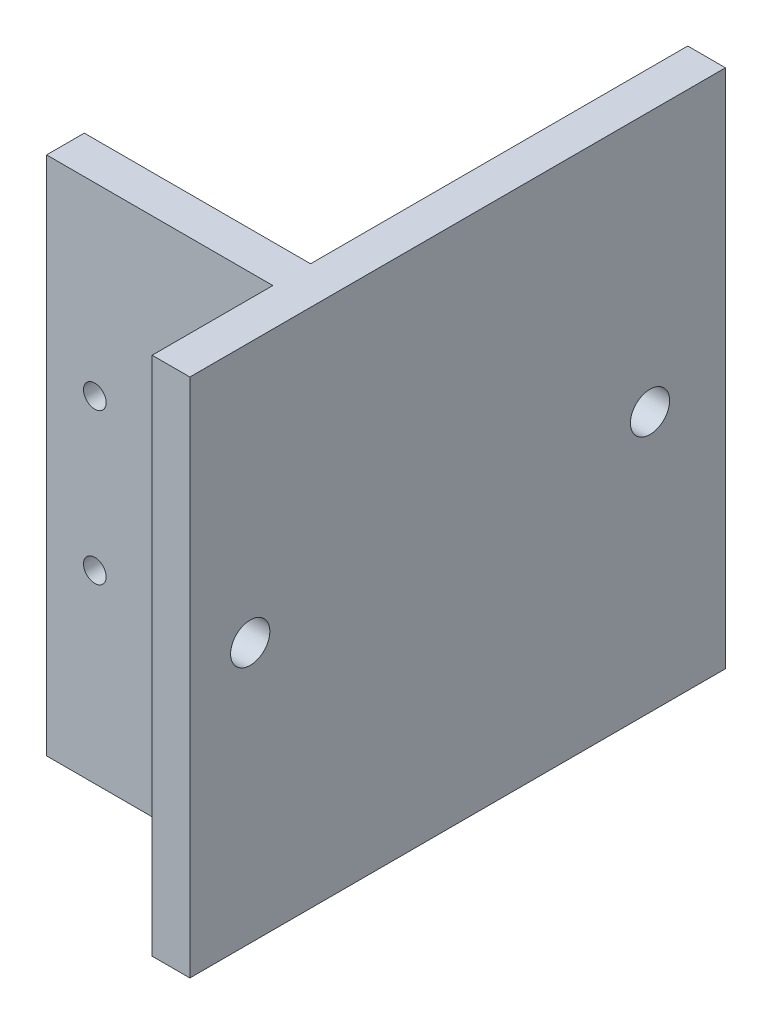
ISO-10303-21;
HEADER;
FILE_DESCRIPTION(('STEP AP214'),'2;1');
FILE_NAME('part.step','',(''),(''),'','','');
FILE_SCHEMA(('AUTOMOTIVE_DESIGN { 1 0 10303 214 1 1 1 1 }'));
ENDSEC;
DATA;
#1=APPLICATION_CONTEXT('core data for automotive mechanical design processes');
#2=APPLICATION_PROTOCOL_DEFINITION('international standard','automotive_design',2000,#1);
#3=PRODUCT_CONTEXT('',#1,'mechanical');
#4=PRODUCT('Part','Part','',(#3));
#5=PRODUCT_RELATED_PRODUCT_CATEGORY('part','',(#4));
#6=PRODUCT_DEFINITION_FORMATION('','',#4);
#7=PRODUCT_DEFINITION_CONTEXT('part definition',#1,'design');
#8=PRODUCT_DEFINITION('design','',#6,#7);
#9=PRODUCT_DEFINITION_SHAPE('','',#8);
#10=(LENGTH_UNIT() NAMED_UNIT(*) SI_UNIT(.MILLI.,.METRE.));
#11=(NAMED_UNIT(*) PLANE_ANGLE_UNIT() SI_UNIT($,.RADIAN.));
#12=(NAMED_UNIT(*) SI_UNIT($,.STERADIAN.) SOLID_ANGLE_UNIT());
#13=UNCERTAINTY_MEASURE_WITH_UNIT(LENGTH_MEASURE(1.E-05),#10,'distance_accuracy_value','');
#14=(GEOMETRIC_REPRESENTATION_CONTEXT(3) GLOBAL_UNCERTAINTY_ASSIGNED_CONTEXT((#13)) GLOBAL_UNIT_ASSIGNED_CONTEXT((#10,
#11,#12)) REPRESENTATION_CONTEXT('',''));
#15=CARTESIAN_POINT('',(0.,0.,0.));
#16=DIRECTION('',(0.,0.,1.));
#17=DIRECTION('',(1.,0.,0.));
#18=AXIS2_PLACEMENT_3D('',#15,#16,#17);
#19=CARTESIAN_POINT('',(0.,69.,0.));
#20=DIRECTION('',(1.,0.,0.));
#21=DIRECTION('',(0.,0.,-1.));
#22=AXIS2_PLACEMENT_3D('',#19,#20,#21);
#23=PLANE('',#22);
#24=DIRECTION('',(0.,0.,1.));
#25=VECTOR('',#24,1.);
#26=CARTESIAN_POINT('',(0.,0.,0.));
#27=LINE('',#26,#25);
#28=CARTESIAN_POINT('',(0.,0.,0.));
#29=VERTEX_POINT('',#28);
#30=CARTESIAN_POINT('',(0.,0.,5.));
#31=VERTEX_POINT('',#30);
#32=EDGE_CURVE('E151',#29,#31,#27,.T.);
#33=ORIENTED_EDGE('',*,*,#32,.T.);
#34=DIRECTION('',(0.,-1.,0.));
#35=VECTOR('',#34,1.);
#36=CARTESIAN_POINT('',(0.,69.,5.));
#37=LINE('',#36,#35);
#38=CARTESIAN_POINT('',(0.,69.,5.));
#39=VERTEX_POINT('',#38);
#40=EDGE_CURVE('E182',#39,#31,#37,.T.);
#41=ORIENTED_EDGE('',*,*,#40,.F.);
#42=DIRECTION('',(0.,0.,1.));
#43=VECTOR('',#42,1.);
#44=CARTESIAN_POINT('',(0.,69.,0.));
#45=LINE('',#44,#43);
#46=CARTESIAN_POINT('',(0.,69.,0.));
#47=VERTEX_POINT('',#46);
#48=EDGE_CURVE('E169',#47,#39,#45,.T.);
#49=ORIENTED_EDGE('',*,*,#48,.F.);
#50=DIRECTION('',(0.,-1.,0.));
#51=VECTOR('',#50,1.);
#52=CARTESIAN_POINT('',(0.,69.,0.));
#53=LINE('',#52,#51);
#54=EDGE_CURVE('E147',#47,#29,#53,.T.);
#55=ORIENTED_EDGE('',*,*,#54,.T.);
#56=EDGE_LOOP('',(#33,#41,#49,#55));
#57=FACE_BOUND('',#56,.T.);
#58=ADVANCED_FACE('F39',(#57),#23,.F.);
#59=CARTESIAN_POINT('',(0.,69.,5.));
#60=DIRECTION('',(0.,0.,-1.));
#61=DIRECTION('',(-1.,0.,0.));
#62=AXIS2_PLACEMENT_3D('',#59,#60,#61);
#63=PLANE('',#62);
#64=CARTESIAN_POINT('',(26.4,44.5,5.));
#65=DIRECTION('',(0.,0.,1.));
#66=DIRECTION('',(1.,0.,0.));
#67=AXIS2_PLACEMENT_3D('',#64,#65,#66);
#68=CIRCLE('',#67,1.50000000000002);
#69=CARTESIAN_POINT('',(27.9,44.5,5.));
#70=VERTEX_POINT('',#69);
#71=EDGE_CURVE('E198',#70,#70,#68,.T.);
#72=ORIENTED_EDGE('',*,*,#71,.F.);
#73=EDGE_LOOP('',(#72));
#74=FACE_BOUND('',#73,.T.);
#75=CARTESIAN_POINT('',(26.4,24.5,5.));
#76=DIRECTION('',(0.,0.,1.));
#77=DIRECTION('',(1.,0.,0.));
#78=AXIS2_PLACEMENT_3D('',#75,#76,#77);
#79=CIRCLE('',#78,1.50000000000002);
#80=CARTESIAN_POINT('',(27.9,24.5,5.));
#81=VERTEX_POINT('',#80);
#82=EDGE_CURVE('E194',#81,#81,#79,.T.);
#83=ORIENTED_EDGE('',*,*,#82,.F.);
#84=EDGE_LOOP('',(#83));
#85=FACE_BOUND('',#84,.T.);
#86=CARTESIAN_POINT('',(6.39999999999999,44.5,5.));
#87=DIRECTION('',(0.,0.,1.));
#88=DIRECTION('',(1.,0.,0.));
#89=AXIS2_PLACEMENT_3D('',#86,#87,#88);
#90=CIRCLE('',#89,1.50000000000001);
#91=CARTESIAN_POINT('',(7.90000000000001,44.5,5.));
#92=VERTEX_POINT('',#91);
#93=EDGE_CURVE('E190',#92,#92,#90,.T.);
#94=ORIENTED_EDGE('',*,*,#93,.F.);
#95=EDGE_LOOP('',(#94));
#96=FACE_BOUND('',#95,.T.);
#97=CARTESIAN_POINT('',(6.39999999999999,24.5,5.));
#98=DIRECTION('',(0.,0.,1.));
#99=DIRECTION('',(1.,0.,0.));
#100=AXIS2_PLACEMENT_3D('',#97,#98,#99);
#101=CIRCLE('',#100,1.50000000000001);
#102=CARTESIAN_POINT('',(7.90000000000001,24.5,5.));
#103=VERTEX_POINT('',#102);
#104=EDGE_CURVE('E186',#103,#103,#101,.T.);
#105=ORIENTED_EDGE('',*,*,#104,.F.);
#106=EDGE_LOOP('',(#105));
#107=FACE_BOUND('',#106,.T.);
#108=DIRECTION('',(1.,0.,0.));
#109=VECTOR('',#108,1.);
#110=CARTESIAN_POINT('',(0.,0.,5.));
#111=LINE('',#110,#109);
#112=CARTESIAN_POINT('',(30.,0.,5.));
#113=VERTEX_POINT('',#112);
#114=EDGE_CURVE('E154',#31,#113,#111,.T.);
#115=ORIENTED_EDGE('',*,*,#114,.T.);
#116=DIRECTION('',(0.,-1.,0.));
#117=VECTOR('',#116,1.);
#118=CARTESIAN_POINT('',(30.,69.,5.));
#119=LINE('',#118,#117);
#120=CARTESIAN_POINT('',(30.,69.,5.));
#121=VERTEX_POINT('',#120);
#122=EDGE_CURVE('E179',#121,#113,#119,.T.);
#123=ORIENTED_EDGE('',*,*,#122,.F.);
#124=DIRECTION('',(1.,0.,0.));
#125=VECTOR('',#124,1.);
#126=CARTESIAN_POINT('',(0.,69.,5.));
#127=LINE('',#126,#125);
#128=EDGE_CURVE('E104',#39,#121,#127,.T.);
#129=ORIENTED_EDGE('',*,*,#128,.F.);
#130=ORIENTED_EDGE('',*,*,#40,.T.);
#131=EDGE_LOOP('',(#115,#123,#129,#130));
#132=FACE_BOUND('',#131,.T.);
#133=ADVANCED_FACE('F242',(#74,#85,#96,#107,#132),#63,.F.);
#134=CARTESIAN_POINT('',(30.,69.,21.));
#135=DIRECTION('',(1.,0.,0.));
#136=DIRECTION('',(0.,0.,-1.));
#137=AXIS2_PLACEMENT_3D('',#134,#135,#136);
#138=PLANE('',#137);
#139=CARTESIAN_POINT('',(30.,34.5,13.));
#140=DIRECTION('',(-1.,0.,0.));
#141=DIRECTION('',(0.,0.,1.));
#142=AXIS2_PLACEMENT_3D('',#139,#140,#141);
#143=CIRCLE('',#142,2.6);
#144=CARTESIAN_POINT('',(30.,34.5,15.6));
#145=VERTEX_POINT('',#144);
#146=EDGE_CURVE('E201',#145,#145,#143,.T.);
#147=ORIENTED_EDGE('',*,*,#146,.F.);
#148=EDGE_LOOP('',(#147));
#149=FACE_BOUND('',#148,.T.);
#150=DIRECTION('',(0.,0.,1.));
#151=VECTOR('',#150,1.);
#152=CARTESIAN_POINT('',(30.,0.,21.));
#153=LINE('',#152,#151);
#154=CARTESIAN_POINT('',(30.,0.,21.));
#155=VERTEX_POINT('',#154);
#156=EDGE_CURVE('E157',#113,#155,#153,.T.);
#157=ORIENTED_EDGE('',*,*,#156,.T.);
#158=DIRECTION('',(0.,-1.,0.));
#159=VECTOR('',#158,1.);
#160=CARTESIAN_POINT('',(30.,69.,21.));
#161=LINE('',#160,#159);
#162=CARTESIAN_POINT('',(30.,69.,21.));
#163=VERTEX_POINT('',#162);
#164=EDGE_CURVE('E176',#163,#155,#161,.T.);
#165=ORIENTED_EDGE('',*,*,#164,.F.);
#166=DIRECTION('',(0.,0.,1.));
#167=VECTOR('',#166,1.);
#168=CARTESIAN_POINT('',(30.,69.,21.));
#169=LINE('',#168,#167);
#170=EDGE_CURVE('E223',#121,#163,#169,.T.);
#171=ORIENTED_EDGE('',*,*,#170,.F.);
#172=ORIENTED_EDGE('',*,*,#122,.T.);
#173=EDGE_LOOP('',(#157,#165,#171,#172));
#174=FACE_BOUND('',#173,.T.);
#175=ADVANCED_FACE('F241',(#149,#174),#138,.F.);
#176=CARTESIAN_POINT('',(30.,69.,21.));
#177=DIRECTION('',(0.,0.,-1.));
#178=DIRECTION('',(-1.,0.,0.));
#179=AXIS2_PLACEMENT_3D('',#176,#177,#178);
#180=PLANE('',#179);
#181=DIRECTION('',(1.,0.,0.));
#182=VECTOR('',#181,1.);
#183=CARTESIAN_POINT('',(30.,0.,21.));
#184=LINE('',#183,#182);
#185=CARTESIAN_POINT('',(35.,0.,21.));
#186=VERTEX_POINT('',#185);
#187=EDGE_CURVE('E159',#155,#186,#184,.T.);
#188=ORIENTED_EDGE('',*,*,#187,.T.);
#189=DIRECTION('',(0.,-1.,0.));
#190=VECTOR('',#189,1.);
#191=CARTESIAN_POINT('',(35.,69.,21.));
#192=LINE('',#191,#190);
#193=CARTESIAN_POINT('',(35.,69.,21.));
#194=VERTEX_POINT('',#193);
#195=EDGE_CURVE('E173',#194,#186,#192,.T.);
#196=ORIENTED_EDGE('',*,*,#195,.F.);
#197=DIRECTION('',(1.,0.,0.));
#198=VECTOR('',#197,1.);
#199=CARTESIAN_POINT('',(30.,69.,21.));
#200=LINE('',#199,#198);
#201=EDGE_CURVE('E229',#163,#194,#200,.T.);
#202=ORIENTED_EDGE('',*,*,#201,.F.);
#203=ORIENTED_EDGE('',*,*,#164,.T.);
#204=EDGE_LOOP('',(#188,#196,#202,#203));
#205=FACE_BOUND('',#204,.T.);
#206=ADVANCED_FACE('F235',(#205),#180,.F.);
#207=CARTESIAN_POINT('',(35.,69.,21.));
#208=DIRECTION('',(-1.,0.,0.));
#209=DIRECTION('',(0.,0.,1.));
#210=AXIS2_PLACEMENT_3D('',#207,#208,#209);
#211=PLANE('',#210);
#212=CARTESIAN_POINT('',(35.,34.5,-40.));
#213=DIRECTION('',(-1.,0.,0.));
#214=DIRECTION('',(0.,0.,1.));
#215=AXIS2_PLACEMENT_3D('',#212,#213,#214);
#216=CIRCLE('',#215,2.6);
#217=CARTESIAN_POINT('',(35.,34.5,-37.4));
#218=VERTEX_POINT('',#217);
#219=EDGE_CURVE('E340',#218,#218,#216,.T.);
#220=ORIENTED_EDGE('',*,*,#219,.T.);
#221=EDGE_LOOP('',(#220));
#222=FACE_BOUND('',#221,.T.);
#223=CARTESIAN_POINT('',(35.,34.5,13.));
#224=DIRECTION('',(-1.,0.,0.));
#225=DIRECTION('',(0.,0.,1.));
#226=AXIS2_PLACEMENT_3D('',#223,#224,#225);
#227=CIRCLE('',#226,2.6);
#228=CARTESIAN_POINT('',(35.,34.5,15.6));
#229=VERTEX_POINT('',#228);
#230=EDGE_CURVE('E199',#229,#229,#227,.T.);
#231=ORIENTED_EDGE('',*,*,#230,.T.);
#232=EDGE_LOOP('',(#231));
#233=FACE_BOUND('',#232,.T.);
#234=DIRECTION('',(0.,0.,-1.));
#235=VECTOR('',#234,1.);
#236=CARTESIAN_POINT('',(35.,0.,21.));
#237=LINE('',#236,#235);
#238=CARTESIAN_POINT('',(35.,0.,-50.));
#239=VERTEX_POINT('',#238);
#240=EDGE_CURVE('E161',#186,#239,#237,.T.);
#241=ORIENTED_EDGE('',*,*,#240,.T.);
#242=DIRECTION('',(0.,-1.,0.));
#243=VECTOR('',#242,1.);
#244=CARTESIAN_POINT('',(35.,69.,-50.));
#245=LINE('',#244,#243);
#246=CARTESIAN_POINT('',(35.,69.,-50.));
#247=VERTEX_POINT('',#246);
#248=EDGE_CURVE('E141',#247,#239,#245,.T.);
#249=ORIENTED_EDGE('',*,*,#248,.F.);
#250=DIRECTION('',(0.,0.,-1.));
#251=VECTOR('',#250,1.);
#252=CARTESIAN_POINT('',(35.,69.,21.));
#253=LINE('',#252,#251);
#254=EDGE_CURVE('E126',#194,#247,#253,.T.);
#255=ORIENTED_EDGE('',*,*,#254,.F.);
#256=ORIENTED_EDGE('',*,*,#195,.T.);
#257=EDGE_LOOP('',(#241,#249,#255,#256));
#258=FACE_BOUND('',#257,.T.);
#259=ADVANCED_FACE('F238',(#222,#233,#258),#211,.F.);
#260=CARTESIAN_POINT('',(30.,69.,-50.));
#261=DIRECTION('',(0.,0.,1.));
#262=DIRECTION('',(1.,0.,0.));
#263=AXIS2_PLACEMENT_3D('',#260,#261,#262);
#264=PLANE('',#263);
#265=DIRECTION('',(0.,-1.,0.));
#266=VECTOR('',#265,1.);
#267=CARTESIAN_POINT('',(30.,69.,-50.));
#268=LINE('',#267,#266);
#269=CARTESIAN_POINT('',(30.,29.5,-50.));
#270=VERTEX_POINT('',#269);
#271=CARTESIAN_POINT('',(30.,0.,-50.));
#272=VERTEX_POINT('',#271);
#273=EDGE_CURVE('E142',#270,#272,#268,.T.);
#274=ORIENTED_EDGE('',*,*,#273,.F.);
#275=DIRECTION('',(1.,0.,0.));
#276=VECTOR('',#275,1.);
#277=CARTESIAN_POINT('',(30.,29.5,-50.));
#278=LINE('',#277,#276);
#279=CARTESIAN_POINT('',(32.,29.5,-50.));
#280=VERTEX_POINT('',#279);
#281=EDGE_CURVE('E211',#270,#280,#278,.T.);
#282=ORIENTED_EDGE('',*,*,#281,.T.);
#283=DIRECTION('',(0.,1.,0.));
#284=VECTOR('',#283,1.);
#285=CARTESIAN_POINT('',(32.,69.,-50.));
#286=LINE('',#285,#284);
#287=CARTESIAN_POINT('',(32.,39.5,-50.));
#288=VERTEX_POINT('',#287);
#289=EDGE_CURVE('E11',#280,#288,#286,.T.);
#290=ORIENTED_EDGE('',*,*,#289,.T.);
#291=DIRECTION('',(-1.,0.,0.));
#292=VECTOR('',#291,1.);
#293=CARTESIAN_POINT('',(30.,39.5,-50.));
#294=LINE('',#293,#292);
#295=CARTESIAN_POINT('',(30.,39.5,-50.));
#296=VERTEX_POINT('',#295);
#297=EDGE_CURVE('E138',#288,#296,#294,.T.);
#298=ORIENTED_EDGE('',*,*,#297,.T.);
#299=CARTESIAN_POINT('',(30.,69.,-50.));
#300=VERTEX_POINT('',#299);
#301=EDGE_CURVE('E133',#300,#296,#268,.T.);
#302=ORIENTED_EDGE('',*,*,#301,.F.);
#303=DIRECTION('',(-1.,0.,0.));
#304=VECTOR('',#303,1.);
#305=CARTESIAN_POINT('',(30.,69.,-50.));
#306=LINE('',#305,#304);
#307=EDGE_CURVE('E119',#247,#300,#306,.T.);
#308=ORIENTED_EDGE('',*,*,#307,.F.);
#309=ORIENTED_EDGE('',*,*,#248,.T.);
#310=DIRECTION('',(-1.,0.,0.));
#311=VECTOR('',#310,1.);
#312=CARTESIAN_POINT('',(30.,0.,-50.));
#313=LINE('',#312,#311);
#314=EDGE_CURVE('E163',#239,#272,#313,.T.);
#315=ORIENTED_EDGE('',*,*,#314,.T.);
#316=EDGE_LOOP('',(#274,#282,#290,#298,#302,#308,#309,#315));
#317=FACE_BOUND('',#316,.T.);
#318=ADVANCED_FACE('F135',(#317),#264,.F.);
#319=CARTESIAN_POINT('',(30.,69.,0.));
#320=DIRECTION('',(1.,0.,0.));
#321=DIRECTION('',(0.,0.,-1.));
#322=AXIS2_PLACEMENT_3D('',#319,#320,#321);
#323=PLANE('',#322);
#324=CARTESIAN_POINT('',(30.,34.5,-40.));
#325=DIRECTION('',(-1.,0.,0.));
#326=DIRECTION('',(0.,0.,1.));
#327=AXIS2_PLACEMENT_3D('',#324,#325,#326);
#328=CIRCLE('',#327,2.6);
#329=CARTESIAN_POINT('',(30.,34.5,-37.4));
#330=VERTEX_POINT('',#329);
#331=EDGE_CURVE('E337',#330,#330,#328,.T.);
#332=ORIENTED_EDGE('',*,*,#331,.F.);
#333=EDGE_LOOP('',(#332));
#334=FACE_BOUND('',#333,.T.);
#335=DIRECTION('',(0.,1.,0.));
#336=VECTOR('',#335,1.);
#337=CARTESIAN_POINT('',(30.,29.5,-49.0000000000003));
#338=LINE('',#337,#336);
#339=CARTESIAN_POINT('',(30.,29.5,-49.0000000000003));
#340=VERTEX_POINT('',#339);
#341=CARTESIAN_POINT('',(30.,39.5,-49.0000000000003));
#342=VERTEX_POINT('',#341);
#343=EDGE_CURVE('E53',#340,#342,#338,.T.);
#344=ORIENTED_EDGE('',*,*,#343,.F.);
#345=DIRECTION('',(0.,0.,-1.));
#346=VECTOR('',#345,1.);
#347=CARTESIAN_POINT('',(30.,29.5,0.));
#348=LINE('',#347,#346);
#349=EDGE_CURVE('E46',#340,#270,#348,.T.);
#350=ORIENTED_EDGE('',*,*,#349,.T.);
#351=ORIENTED_EDGE('',*,*,#273,.T.);
#352=DIRECTION('',(0.,0.,1.));
#353=VECTOR('',#352,1.);
#354=CARTESIAN_POINT('',(30.,0.,0.));
#355=LINE('',#354,#353);
#356=CARTESIAN_POINT('',(30.,0.,0.));
#357=VERTEX_POINT('',#356);
#358=EDGE_CURVE('E166',#272,#357,#355,.T.);
#359=ORIENTED_EDGE('',*,*,#358,.T.);
#360=DIRECTION('',(0.,-1.,0.));
#361=VECTOR('',#360,1.);
#362=CARTESIAN_POINT('',(30.,69.,0.));
#363=LINE('',#362,#361);
#364=CARTESIAN_POINT('',(30.,69.,0.));
#365=VERTEX_POINT('',#364);
#366=EDGE_CURVE('E145',#365,#357,#363,.T.);
#367=ORIENTED_EDGE('',*,*,#366,.F.);
#368=DIRECTION('',(0.,0.,1.));
#369=VECTOR('',#368,1.);
#370=CARTESIAN_POINT('',(30.,69.,0.));
#371=LINE('',#370,#369);
#372=EDGE_CURVE('E123',#300,#365,#371,.T.);
#373=ORIENTED_EDGE('',*,*,#372,.F.);
#374=ORIENTED_EDGE('',*,*,#301,.T.);
#375=DIRECTION('',(0.,0.,-1.));
#376=VECTOR('',#375,1.);
#377=CARTESIAN_POINT('',(30.,39.5,-51.0000000000003));
#378=LINE('',#377,#376);
#379=EDGE_CURVE('E327',#342,#296,#378,.T.);
#380=ORIENTED_EDGE('',*,*,#379,.F.);
#381=EDGE_LOOP('',(#344,#350,#351,#359,#367,#373,#374,#380));
#382=FACE_BOUND('',#381,.T.);
#383=ADVANCED_FACE('F144',(#334,#382),#323,.F.);
#384=CARTESIAN_POINT('',(0.,69.,0.));
#385=DIRECTION('',(0.,0.,1.));
#386=DIRECTION('',(1.,0.,0.));
#387=AXIS2_PLACEMENT_3D('',#384,#385,#386);
#388=PLANE('',#387);
#389=CARTESIAN_POINT('',(26.4,44.5,0.));
#390=DIRECTION('',(0.,0.,1.));
#391=DIRECTION('',(1.,0.,0.));
#392=AXIS2_PLACEMENT_3D('',#389,#390,#391);
#393=CIRCLE('',#392,1.50000000000001);
#394=CARTESIAN_POINT('',(27.9,44.5,0.));
#395=VERTEX_POINT('',#394);
#396=EDGE_CURVE('E195',#395,#395,#393,.T.);
#397=ORIENTED_EDGE('',*,*,#396,.T.);
#398=EDGE_LOOP('',(#397));
#399=FACE_BOUND('',#398,.T.);
#400=CARTESIAN_POINT('',(26.4,24.5,0.));
#401=DIRECTION('',(0.,0.,1.));
#402=DIRECTION('',(1.,0.,0.));
#403=AXIS2_PLACEMENT_3D('',#400,#401,#402);
#404=CIRCLE('',#403,1.50000000000001);
#405=CARTESIAN_POINT('',(27.9,24.5,0.));
#406=VERTEX_POINT('',#405);
#407=EDGE_CURVE('E191',#406,#406,#404,.T.);
#408=ORIENTED_EDGE('',*,*,#407,.T.);
#409=EDGE_LOOP('',(#408));
#410=FACE_BOUND('',#409,.T.);
#411=CARTESIAN_POINT('',(6.39999999999999,44.5,0.));
#412=DIRECTION('',(0.,0.,1.));
#413=DIRECTION('',(1.,0.,0.));
#414=AXIS2_PLACEMENT_3D('',#411,#412,#413);
#415=CIRCLE('',#414,1.50000000000001);
#416=CARTESIAN_POINT('',(7.9,44.5,0.));
#417=VERTEX_POINT('',#416);
#418=EDGE_CURVE('E187',#417,#417,#415,.T.);
#419=ORIENTED_EDGE('',*,*,#418,.T.);
#420=EDGE_LOOP('',(#419));
#421=FACE_BOUND('',#420,.T.);
#422=CARTESIAN_POINT('',(6.39999999999999,24.5,0.));
#423=DIRECTION('',(0.,0.,1.));
#424=DIRECTION('',(1.,0.,0.));
#425=AXIS2_PLACEMENT_3D('',#422,#423,#424);
#426=CIRCLE('',#425,1.50000000000001);
#427=CARTESIAN_POINT('',(7.9,24.5,0.));
#428=VERTEX_POINT('',#427);
#429=EDGE_CURVE('E155',#428,#428,#426,.T.);
#430=ORIENTED_EDGE('',*,*,#429,.T.);
#431=EDGE_LOOP('',(#430));
#432=FACE_BOUND('',#431,.T.);
#433=DIRECTION('',(-1.,0.,0.));
#434=VECTOR('',#433,1.);
#435=CARTESIAN_POINT('',(0.,0.,0.));
#436=LINE('',#435,#434);
#437=EDGE_CURVE('E95',#357,#29,#436,.T.);
#438=ORIENTED_EDGE('',*,*,#437,.T.);
#439=ORIENTED_EDGE('',*,*,#54,.F.);
#440=DIRECTION('',(-1.,0.,0.));
#441=VECTOR('',#440,1.);
#442=CARTESIAN_POINT('',(0.,69.,0.));
#443=LINE('',#442,#441);
#444=EDGE_CURVE('E62',#365,#47,#443,.T.);
#445=ORIENTED_EDGE('',*,*,#444,.F.);
#446=ORIENTED_EDGE('',*,*,#366,.T.);
#447=EDGE_LOOP('',(#438,#439,#445,#446));
#448=FACE_BOUND('',#447,.T.);
#449=ADVANCED_FACE('F218',(#399,#410,#421,#432,#448),#388,.F.);
#450=CARTESIAN_POINT('',(0.,69.,0.));
#451=DIRECTION('',(0.,1.,0.));
#452=DIRECTION('',(0.,0.,1.));
#453=AXIS2_PLACEMENT_3D('',#450,#451,#452);
#454=PLANE('',#453);
#455=ORIENTED_EDGE('',*,*,#48,.T.);
#456=ORIENTED_EDGE('',*,*,#128,.T.);
#457=ORIENTED_EDGE('',*,*,#170,.T.);
#458=ORIENTED_EDGE('',*,*,#201,.T.);
#459=ORIENTED_EDGE('',*,*,#254,.T.);
#460=ORIENTED_EDGE('',*,*,#307,.T.);
#461=ORIENTED_EDGE('',*,*,#372,.T.);
#462=ORIENTED_EDGE('',*,*,#444,.T.);
#463=EDGE_LOOP('',(#455,#456,#457,#458,#459,#460,#461,#462));
#464=FACE_BOUND('',#463,.T.);
#465=ADVANCED_FACE('F121',(#464),#454,.T.);
#466=CARTESIAN_POINT('',(0.,0.,0.));
#467=DIRECTION('',(0.,1.,0.));
#468=DIRECTION('',(0.,0.,1.));
#469=AXIS2_PLACEMENT_3D('',#466,#467,#468);
#470=PLANE('',#469);
#471=ORIENTED_EDGE('',*,*,#32,.F.);
#472=ORIENTED_EDGE('',*,*,#437,.F.);
#473=ORIENTED_EDGE('',*,*,#358,.F.);
#474=ORIENTED_EDGE('',*,*,#314,.F.);
#475=ORIENTED_EDGE('',*,*,#240,.F.);
#476=ORIENTED_EDGE('',*,*,#187,.F.);
#477=ORIENTED_EDGE('',*,*,#156,.F.);
#478=ORIENTED_EDGE('',*,*,#114,.F.);
#479=EDGE_LOOP('',(#471,#472,#473,#474,#475,#476,#477,#478));
#480=FACE_BOUND('',#479,.T.);
#481=ADVANCED_FACE('F217',(#480),#470,.F.);
#482=CARTESIAN_POINT('',(6.39999999999999,24.5,5.));
#483=DIRECTION('',(0.,0.,1.));
#484=DIRECTION('',(1.,0.,0.));
#485=AXIS2_PLACEMENT_3D('',#482,#483,#484);
#486=CYLINDRICAL_SURFACE('',#485,1.50000000000001);
#487=ORIENTED_EDGE('',*,*,#104,.T.);
#488=EDGE_LOOP('',(#487));
#489=FACE_BOUND('',#488,.T.);
#490=ORIENTED_EDGE('',*,*,#429,.F.);
#491=EDGE_LOOP('',(#490));
#492=FACE_BOUND('',#491,.T.);
#493=ADVANCED_FACE('F269',(#489,#492),#486,.F.);
#494=CARTESIAN_POINT('',(6.39999999999999,44.5,5.));
#495=DIRECTION('',(0.,0.,1.));
#496=DIRECTION('',(1.,0.,0.));
#497=AXIS2_PLACEMENT_3D('',#494,#495,#496);
#498=CYLINDRICAL_SURFACE('',#497,1.50000000000001);
#499=ORIENTED_EDGE('',*,*,#93,.T.);
#500=EDGE_LOOP('',(#499));
#501=FACE_BOUND('',#500,.T.);
#502=ORIENTED_EDGE('',*,*,#418,.F.);
#503=EDGE_LOOP('',(#502));
#504=FACE_BOUND('',#503,.T.);
#505=ADVANCED_FACE('F274',(#501,#504),#498,.F.);
#506=CARTESIAN_POINT('',(26.4,24.5,5.));
#507=DIRECTION('',(0.,0.,1.));
#508=DIRECTION('',(1.,0.,0.));
#509=AXIS2_PLACEMENT_3D('',#506,#507,#508);
#510=CYLINDRICAL_SURFACE('',#509,1.50000000000001);
#511=ORIENTED_EDGE('',*,*,#82,.T.);
#512=EDGE_LOOP('',(#511));
#513=FACE_BOUND('',#512,.T.);
#514=ORIENTED_EDGE('',*,*,#407,.F.);
#515=EDGE_LOOP('',(#514));
#516=FACE_BOUND('',#515,.T.);
#517=ADVANCED_FACE('F278',(#513,#516),#510,.F.);
#518=CARTESIAN_POINT('',(26.4,44.5,5.));
#519=DIRECTION('',(0.,0.,1.));
#520=DIRECTION('',(1.,0.,0.));
#521=AXIS2_PLACEMENT_3D('',#518,#519,#520);
#522=CYLINDRICAL_SURFACE('',#521,1.50000000000001);
#523=ORIENTED_EDGE('',*,*,#71,.T.);
#524=EDGE_LOOP('',(#523));
#525=FACE_BOUND('',#524,.T.);
#526=ORIENTED_EDGE('',*,*,#396,.F.);
#527=EDGE_LOOP('',(#526));
#528=FACE_BOUND('',#527,.T.);
#529=ADVANCED_FACE('F282',(#525,#528),#522,.F.);
#530=CARTESIAN_POINT('',(40.,34.5,13.));
#531=DIRECTION('',(-1.,0.,0.));
#532=DIRECTION('',(0.,0.,1.));
#533=AXIS2_PLACEMENT_3D('',#530,#531,#532);
#534=CYLINDRICAL_SURFACE('',#533,2.6);
#535=ORIENTED_EDGE('',*,*,#146,.T.);
#536=EDGE_LOOP('',(#535));
#537=FACE_BOUND('',#536,.T.);
#538=ORIENTED_EDGE('',*,*,#230,.F.);
#539=EDGE_LOOP('',(#538));
#540=FACE_BOUND('',#539,.T.);
#541=ADVANCED_FACE('F286',(#537,#540),#534,.F.);
#542=CARTESIAN_POINT('',(40.,34.5,-40.));
#543=DIRECTION('',(-1.,0.,0.));
#544=DIRECTION('',(0.,0.,1.));
#545=AXIS2_PLACEMENT_3D('',#542,#543,#544);
#546=CYLINDRICAL_SURFACE('',#545,2.6);
#547=ORIENTED_EDGE('',*,*,#331,.T.);
#548=EDGE_LOOP('',(#547));
#549=FACE_BOUND('',#548,.T.);
#550=ORIENTED_EDGE('',*,*,#219,.F.);
#551=EDGE_LOOP('',(#550));
#552=FACE_BOUND('',#551,.T.);
#553=ADVANCED_FACE('F290',(#549,#552),#546,.F.);
#554=CARTESIAN_POINT('',(32.,0.,0.));
#555=DIRECTION('',(1.,0.,0.));
#556=DIRECTION('',(0.,0.,-1.));
#557=AXIS2_PLACEMENT_3D('',#554,#555,#556);
#558=PLANE('',#557);
#559=DIRECTION('',(0.,0.,1.));
#560=VECTOR('',#559,1.);
#561=CARTESIAN_POINT('',(32.,29.5,-51.0000000000003));
#562=LINE('',#561,#560);
#563=CARTESIAN_POINT('',(32.,29.5,-49.0000000000003));
#564=VERTEX_POINT('',#563);
#565=EDGE_CURVE('E315',#280,#564,#562,.T.);
#566=ORIENTED_EDGE('',*,*,#565,.T.);
#567=DIRECTION('',(0.,1.,0.));
#568=VECTOR('',#567,1.);
#569=CARTESIAN_POINT('',(32.,29.5,-49.0000000000003));
#570=LINE('',#569,#568);
#571=CARTESIAN_POINT('',(32.,39.5,-49.0000000000003));
#572=VERTEX_POINT('',#571);
#573=EDGE_CURVE('E319',#564,#572,#570,.T.);
#574=ORIENTED_EDGE('',*,*,#573,.T.);
#575=DIRECTION('',(0.,0.,-1.));
#576=VECTOR('',#575,1.);
#577=CARTESIAN_POINT('',(32.,39.5,-51.0000000000003));
#578=LINE('',#577,#576);
#579=EDGE_CURVE('E322',#572,#288,#578,.T.);
#580=ORIENTED_EDGE('',*,*,#579,.T.);
#581=ORIENTED_EDGE('',*,*,#289,.F.);
#582=EDGE_LOOP('',(#566,#574,#580,#581));
#583=FACE_BOUND('',#582,.T.);
#584=ADVANCED_FACE('F294',(#583),#558,.F.);
#585=CARTESIAN_POINT('',(32.,29.5,-51.0000000000003));
#586=DIRECTION('',(0.,-1.,0.));
#587=DIRECTION('',(0.,0.,-1.));
#588=AXIS2_PLACEMENT_3D('',#585,#586,#587);
#589=PLANE('',#588);
#590=ORIENTED_EDGE('',*,*,#349,.F.);
#591=DIRECTION('',(-1.,0.,0.));
#592=VECTOR('',#591,1.);
#593=CARTESIAN_POINT('',(32.,29.5,-49.0000000000003));
#594=LINE('',#593,#592);
#595=EDGE_CURVE('E324',#564,#340,#594,.T.);
#596=ORIENTED_EDGE('',*,*,#595,.F.);
#597=ORIENTED_EDGE('',*,*,#565,.F.);
#598=ORIENTED_EDGE('',*,*,#281,.F.);
#599=EDGE_LOOP('',(#590,#596,#597,#598));
#600=FACE_BOUND('',#599,.T.);
#601=ADVANCED_FACE('F302',(#600),#589,.F.);
#602=CARTESIAN_POINT('',(32.,39.5,-51.0000000000003));
#603=DIRECTION('',(0.,1.,0.));
#604=DIRECTION('',(0.,0.,1.));
#605=AXIS2_PLACEMENT_3D('',#602,#603,#604);
#606=PLANE('',#605);
#607=ORIENTED_EDGE('',*,*,#579,.F.);
#608=DIRECTION('',(-1.,0.,0.));
#609=VECTOR('',#608,1.);
#610=CARTESIAN_POINT('',(32.,39.5,-49.0000000000003));
#611=LINE('',#610,#609);
#612=EDGE_CURVE('E321',#572,#342,#611,.T.);
#613=ORIENTED_EDGE('',*,*,#612,.T.);
#614=ORIENTED_EDGE('',*,*,#379,.T.);
#615=ORIENTED_EDGE('',*,*,#297,.F.);
#616=EDGE_LOOP('',(#607,#613,#614,#615));
#617=FACE_BOUND('',#616,.T.);
#618=ADVANCED_FACE('F299',(#617),#606,.F.);
#619=CARTESIAN_POINT('',(32.,29.5,-49.0000000000003));
#620=DIRECTION('',(0.,0.,1.));
#621=DIRECTION('',(1.,0.,0.));
#622=AXIS2_PLACEMENT_3D('',#619,#620,#621);
#623=PLANE('',#622);
#624=ORIENTED_EDGE('',*,*,#343,.T.);
#625=ORIENTED_EDGE('',*,*,#612,.F.);
#626=ORIENTED_EDGE('',*,*,#573,.F.);
#627=ORIENTED_EDGE('',*,*,#595,.T.);
#628=EDGE_LOOP('',(#624,#625,#626,#627));
#629=FACE_BOUND('',#628,.T.);
#630=ADVANCED_FACE('F296',(#629),#623,.F.);
#631=CLOSED_SHELL('',(#58,#133,#175,#206,#259,#318,#383,#449,#465,#481,#493,#505,#517,#529,#541,
#553,#584,#601,#618,#630));
#632=MANIFOLD_SOLID_BREP('B2',#631);
#633=ADVANCED_BREP_SHAPE_REPRESENTATION('',(#18,#632),#14);
#634=SHAPE_DEFINITION_REPRESENTATION(#9,#633);
ENDSEC;
END-ISO-10303-21;
